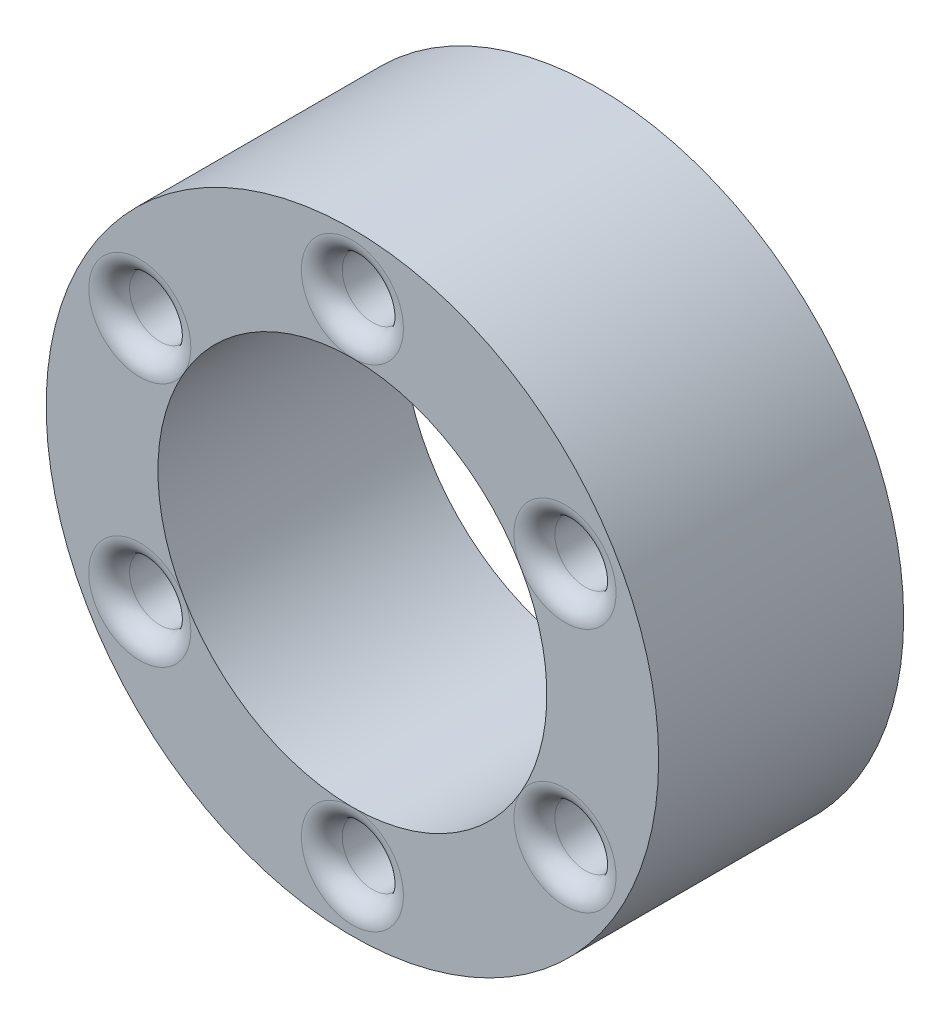
ISO-10303-21;
HEADER;
FILE_DESCRIPTION(('STEP AP214'),'2;1');
FILE_NAME('part.step','',(''),(''),'','','');
FILE_SCHEMA(('AUTOMOTIVE_DESIGN { 1 0 10303 214 1 1 1 1 }'));
ENDSEC;
DATA;
#1=APPLICATION_CONTEXT('core data for automotive mechanical design processes');
#2=APPLICATION_PROTOCOL_DEFINITION('international standard','automotive_design',2000,#1);
#3=PRODUCT_CONTEXT('',#1,'mechanical');
#4=PRODUCT('Part','Part','',(#3));
#5=PRODUCT_RELATED_PRODUCT_CATEGORY('part','',(#4));
#6=PRODUCT_DEFINITION_FORMATION('','',#4);
#7=PRODUCT_DEFINITION_CONTEXT('part definition',#1,'design');
#8=PRODUCT_DEFINITION('design','',#6,#7);
#9=PRODUCT_DEFINITION_SHAPE('','',#8);
#10=(LENGTH_UNIT() NAMED_UNIT(*) SI_UNIT(.MILLI.,.METRE.));
#11=(NAMED_UNIT(*) PLANE_ANGLE_UNIT() SI_UNIT($,.RADIAN.));
#12=(NAMED_UNIT(*) SI_UNIT($,.STERADIAN.) SOLID_ANGLE_UNIT());
#13=UNCERTAINTY_MEASURE_WITH_UNIT(LENGTH_MEASURE(1.E-05),#10,'distance_accuracy_value','');
#14=(GEOMETRIC_REPRESENTATION_CONTEXT(3) GLOBAL_UNCERTAINTY_ASSIGNED_CONTEXT((#13)) GLOBAL_UNIT_ASSIGNED_CONTEXT((#10,
#11,#12)) REPRESENTATION_CONTEXT('',''));
#15=CARTESIAN_POINT('',(0.,0.,0.));
#16=DIRECTION('',(0.,0.,1.));
#17=DIRECTION('',(1.,0.,0.));
#18=AXIS2_PLACEMENT_3D('',#15,#16,#17);
#19=CARTESIAN_POINT('',(0.,0.,3.));
#20=DIRECTION('',(0.,0.,1.));
#21=DIRECTION('',(1.,0.,0.));
#22=AXIS2_PLACEMENT_3D('',#19,#20,#21);
#23=PLANE('',#22);
#24=CARTESIAN_POINT('',(0.,0.,3.));
#25=DIRECTION('',(0.,0.,1.));
#26=DIRECTION('',(1.,0.,0.));
#27=AXIS2_PLACEMENT_3D('',#24,#25,#26);
#28=CIRCLE('',#27,3.75);
#29=CARTESIAN_POINT('',(3.75,0.,3.));
#30=VERTEX_POINT('',#29);
#31=EDGE_CURVE('E253',#30,#30,#28,.T.);
#32=ORIENTED_EDGE('',*,*,#31,.T.);
#33=EDGE_LOOP('',(#32));
#34=FACE_BOUND('',#33,.T.);
#35=CARTESIAN_POINT('',(0.,0.,3.));
#36=DIRECTION('',(0.,0.,1.));
#37=DIRECTION('',(1.,0.,0.));
#38=AXIS2_PLACEMENT_3D('',#35,#36,#37);
#39=CIRCLE('',#38,2.38125);
#40=CARTESIAN_POINT('',(-2.06222299276169,-1.190625,3.));
#41=VERTEX_POINT('',#40);
#42=CARTESIAN_POINT('',(0.,-2.38125,3.));
#43=VERTEX_POINT('',#42);
#44=EDGE_CURVE('E274',#41,#43,#39,.T.);
#45=ORIENTED_EDGE('',*,*,#44,.F.);
#46=CARTESIAN_POINT('',(-2.60348887012697,-1.503125,3.));
#47=DIRECTION('',(0.,0.,1.));
#48=DIRECTION('',(1.,0.,0.));
#49=AXIS2_PLACEMENT_3D('',#46,#47,#48);
#50=CIRCLE('',#49,0.625);
#51=EDGE_CURVE('E121',#41,#41,#50,.F.);
#52=ORIENTED_EDGE('',*,*,#51,.T.);
#53=CARTESIAN_POINT('',(-2.0622229927617,1.190625,3.));
#54=VERTEX_POINT('',#53);
#55=EDGE_CURVE('E270',#54,#41,#39,.T.);
#56=ORIENTED_EDGE('',*,*,#55,.F.);
#57=CARTESIAN_POINT('',(-2.60348887012697,1.503125,3.));
#58=DIRECTION('',(0.,0.,1.));
#59=DIRECTION('',(1.,0.,0.));
#60=AXIS2_PLACEMENT_3D('',#57,#58,#59);
#61=CIRCLE('',#60,0.625);
#62=EDGE_CURVE('E110',#54,#54,#61,.F.);
#63=ORIENTED_EDGE('',*,*,#62,.T.);
#64=CARTESIAN_POINT('',(0.,2.38125,3.));
#65=VERTEX_POINT('',#64);
#66=EDGE_CURVE('E266',#65,#54,#39,.T.);
#67=ORIENTED_EDGE('',*,*,#66,.F.);
#68=CARTESIAN_POINT('',(0.,3.00625,3.));
#69=DIRECTION('',(0.,0.,1.));
#70=DIRECTION('',(1.,0.,0.));
#71=AXIS2_PLACEMENT_3D('',#68,#69,#70);
#72=CIRCLE('',#71,0.625);
#73=EDGE_CURVE('E113',#65,#65,#72,.F.);
#74=ORIENTED_EDGE('',*,*,#73,.T.);
#75=CARTESIAN_POINT('',(2.06222299276169,1.190625,3.));
#76=VERTEX_POINT('',#75);
#77=EDGE_CURVE('E258',#76,#65,#39,.T.);
#78=ORIENTED_EDGE('',*,*,#77,.F.);
#79=CARTESIAN_POINT('',(2.60348887012697,1.503125,3.));
#80=DIRECTION('',(0.,0.,1.));
#81=DIRECTION('',(1.,0.,0.));
#82=AXIS2_PLACEMENT_3D('',#79,#80,#81);
#83=CIRCLE('',#82,0.625);
#84=EDGE_CURVE('E116',#76,#76,#83,.F.);
#85=ORIENTED_EDGE('',*,*,#84,.T.);
#86=CARTESIAN_POINT('',(2.0622229927617,-1.190625,3.));
#87=VERTEX_POINT('',#86);
#88=EDGE_CURVE('E262',#87,#76,#39,.T.);
#89=ORIENTED_EDGE('',*,*,#88,.F.);
#90=CARTESIAN_POINT('',(2.60348887012697,-1.503125,3.));
#91=DIRECTION('',(0.,0.,1.));
#92=DIRECTION('',(1.,0.,0.));
#93=AXIS2_PLACEMENT_3D('',#90,#91,#92);
#94=CIRCLE('',#93,0.625);
#95=EDGE_CURVE('E46',#87,#87,#94,.F.);
#96=ORIENTED_EDGE('',*,*,#95,.T.);
#97=EDGE_CURVE('E271',#43,#87,#39,.T.);
#98=ORIENTED_EDGE('',*,*,#97,.F.);
#99=CARTESIAN_POINT('',(0.,-3.00625,3.));
#100=DIRECTION('',(0.,0.,1.));
#101=DIRECTION('',(1.,0.,0.));
#102=AXIS2_PLACEMENT_3D('',#99,#100,#101);
#103=CIRCLE('',#102,0.625);
#104=EDGE_CURVE('E51',#43,#43,#103,.F.);
#105=ORIENTED_EDGE('',*,*,#104,.T.);
#106=EDGE_LOOP('',(#45,#52,#56,#63,#67,#74,#78,#85,#89,#96,#98,#105));
#107=FACE_BOUND('',#106,.T.);
#108=ADVANCED_FACE('F33',(#34,#107),#23,.T.);
#109=CARTESIAN_POINT('',(0.,0.,0.));
#110=DIRECTION('',(0.,0.,1.));
#111=DIRECTION('',(1.,0.,0.));
#112=AXIS2_PLACEMENT_3D('',#109,#110,#111);
#113=PLANE('',#112);
#114=CARTESIAN_POINT('',(0.,0.,0.));
#115=DIRECTION('',(0.,0.,1.));
#116=DIRECTION('',(1.,0.,0.));
#117=AXIS2_PLACEMENT_3D('',#114,#115,#116);
#118=CIRCLE('',#117,3.75);
#119=CARTESIAN_POINT('',(3.75,0.,0.));
#120=VERTEX_POINT('',#119);
#121=EDGE_CURVE('E254',#120,#120,#118,.T.);
#122=ORIENTED_EDGE('',*,*,#121,.F.);
#123=EDGE_LOOP('',(#122));
#124=FACE_BOUND('',#123,.T.);
#125=CARTESIAN_POINT('',(0.,0.,0.));
#126=DIRECTION('',(0.,0.,1.));
#127=DIRECTION('',(1.,0.,0.));
#128=AXIS2_PLACEMENT_3D('',#125,#126,#127);
#129=CIRCLE('',#128,2.38125);
#130=CARTESIAN_POINT('',(-2.0622229927617,1.190625,0.));
#131=VERTEX_POINT('',#130);
#132=CARTESIAN_POINT('',(-2.06222299276169,-1.190625,0.));
#133=VERTEX_POINT('',#132);
#134=EDGE_CURVE('E294',#131,#133,#129,.T.);
#135=ORIENTED_EDGE('',*,*,#134,.T.);
#136=CARTESIAN_POINT('',(-2.60348887012697,-1.503125,0.));
#137=DIRECTION('',(0.,0.,1.));
#138=DIRECTION('',(1.,0.,0.));
#139=AXIS2_PLACEMENT_3D('',#136,#137,#138);
#140=CIRCLE('',#139,0.625);
#141=EDGE_CURVE('E101',#133,#133,#140,.T.);
#142=ORIENTED_EDGE('',*,*,#141,.T.);
#143=CARTESIAN_POINT('',(0.,-2.38125,0.));
#144=VERTEX_POINT('',#143);
#145=EDGE_CURVE('E295',#133,#144,#129,.T.);
#146=ORIENTED_EDGE('',*,*,#145,.T.);
#147=CARTESIAN_POINT('',(0.,-3.00625,0.));
#148=DIRECTION('',(0.,0.,1.));
#149=DIRECTION('',(1.,0.,0.));
#150=AXIS2_PLACEMENT_3D('',#147,#148,#149);
#151=CIRCLE('',#150,0.625);
#152=EDGE_CURVE('E92',#144,#144,#151,.T.);
#153=ORIENTED_EDGE('',*,*,#152,.T.);
#154=CARTESIAN_POINT('',(2.0622229927617,-1.190625,0.));
#155=VERTEX_POINT('',#154);
#156=EDGE_CURVE('E297',#144,#155,#129,.T.);
#157=ORIENTED_EDGE('',*,*,#156,.T.);
#158=CARTESIAN_POINT('',(2.60348887012697,-1.503125,0.));
#159=DIRECTION('',(0.,0.,1.));
#160=DIRECTION('',(1.,0.,0.));
#161=AXIS2_PLACEMENT_3D('',#158,#159,#160);
#162=CIRCLE('',#161,0.625);
#163=EDGE_CURVE('E88',#155,#155,#162,.T.);
#164=ORIENTED_EDGE('',*,*,#163,.T.);
#165=CARTESIAN_POINT('',(2.06222299276169,1.190625,0.));
#166=VERTEX_POINT('',#165);
#167=EDGE_CURVE('E264',#155,#166,#129,.T.);
#168=ORIENTED_EDGE('',*,*,#167,.T.);
#169=CARTESIAN_POINT('',(2.60348887012697,1.503125,0.));
#170=DIRECTION('',(0.,0.,1.));
#171=DIRECTION('',(1.,0.,0.));
#172=AXIS2_PLACEMENT_3D('',#169,#170,#171);
#173=CIRCLE('',#172,0.625);
#174=EDGE_CURVE('E83',#166,#166,#173,.T.);
#175=ORIENTED_EDGE('',*,*,#174,.T.);
#176=CARTESIAN_POINT('',(0.,2.38125,0.));
#177=VERTEX_POINT('',#176);
#178=EDGE_CURVE('E260',#166,#177,#129,.T.);
#179=ORIENTED_EDGE('',*,*,#178,.T.);
#180=CARTESIAN_POINT('',(0.,3.00625,0.));
#181=DIRECTION('',(0.,0.,1.));
#182=DIRECTION('',(1.,0.,0.));
#183=AXIS2_PLACEMENT_3D('',#180,#181,#182);
#184=CIRCLE('',#183,0.625);
#185=EDGE_CURVE('E89',#177,#177,#184,.T.);
#186=ORIENTED_EDGE('',*,*,#185,.T.);
#187=EDGE_CURVE('E263',#177,#131,#129,.T.);
#188=ORIENTED_EDGE('',*,*,#187,.T.);
#189=CARTESIAN_POINT('',(-2.60348887012697,1.503125,0.));
#190=DIRECTION('',(0.,0.,1.));
#191=DIRECTION('',(1.,0.,0.));
#192=AXIS2_PLACEMENT_3D('',#189,#190,#191);
#193=CIRCLE('',#192,0.625);
#194=EDGE_CURVE('E95',#131,#131,#193,.T.);
#195=ORIENTED_EDGE('',*,*,#194,.T.);
#196=EDGE_LOOP('',(#135,#142,#146,#153,#157,#164,#168,#175,#179,#186,#188,#195));
#197=FACE_BOUND('',#196,.T.);
#198=ADVANCED_FACE('F161',(#124,#197),#113,.F.);
#199=CARTESIAN_POINT('',(0.,0.,3.));
#200=DIRECTION('',(0.,0.,-1.));
#201=DIRECTION('',(-1.,0.,0.));
#202=AXIS2_PLACEMENT_3D('',#199,#200,#201);
#203=CYLINDRICAL_SURFACE('',#202,3.75);
#204=ORIENTED_EDGE('',*,*,#31,.F.);
#205=EDGE_LOOP('',(#204));
#206=FACE_BOUND('',#205,.T.);
#207=ORIENTED_EDGE('',*,*,#121,.T.);
#208=EDGE_LOOP('',(#207));
#209=FACE_BOUND('',#208,.T.);
#210=ADVANCED_FACE('F167',(#206,#209),#203,.T.);
#211=CARTESIAN_POINT('',(0.,0.,3.));
#212=DIRECTION('',(0.,0.,-1.));
#213=DIRECTION('',(-1.,0.,0.));
#214=AXIS2_PLACEMENT_3D('',#211,#212,#213);
#215=CYLINDRICAL_SURFACE('',#214,2.38125);
#216=ORIENTED_EDGE('',*,*,#77,.T.);
#217=ORIENTED_EDGE('',*,*,#66,.T.);
#218=ORIENTED_EDGE('',*,*,#55,.T.);
#219=ORIENTED_EDGE('',*,*,#44,.T.);
#220=ORIENTED_EDGE('',*,*,#97,.T.);
#221=ORIENTED_EDGE('',*,*,#88,.T.);
#222=EDGE_LOOP('',(#216,#217,#218,#219,#220,#221));
#223=FACE_BOUND('',#222,.T.);
#224=ORIENTED_EDGE('',*,*,#178,.F.);
#225=ORIENTED_EDGE('',*,*,#167,.F.);
#226=ORIENTED_EDGE('',*,*,#156,.F.);
#227=ORIENTED_EDGE('',*,*,#145,.F.);
#228=ORIENTED_EDGE('',*,*,#134,.F.);
#229=ORIENTED_EDGE('',*,*,#187,.F.);
#230=EDGE_LOOP('',(#224,#225,#226,#227,#228,#229));
#231=FACE_BOUND('',#230,.T.);
#232=ADVANCED_FACE('F173',(#223,#231),#215,.F.);
#233=CARTESIAN_POINT('',(0.,3.00625,3.));
#234=DIRECTION('',(0.,0.,-1.));
#235=DIRECTION('',(-1.,0.,0.));
#236=AXIS2_PLACEMENT_3D('',#233,#234,#235);
#237=CYLINDRICAL_SURFACE('',#236,0.375);
#238=CARTESIAN_POINT('',(0.,3.00625,0.25));
#239=DIRECTION('',(0.,0.,1.));
#240=DIRECTION('',(1.,0.,0.));
#241=AXIS2_PLACEMENT_3D('',#238,#239,#240);
#242=CIRCLE('',#241,0.375);
#243=CARTESIAN_POINT('',(0.375,3.00625,0.25));
#244=VERTEX_POINT('',#243);
#245=EDGE_CURVE('E145',#244,#244,#242,.F.);
#246=ORIENTED_EDGE('',*,*,#245,.T.);
#247=EDGE_LOOP('',(#246));
#248=FACE_BOUND('',#247,.T.);
#249=CARTESIAN_POINT('',(0.,3.00625,2.75));
#250=DIRECTION('',(0.,0.,1.));
#251=DIRECTION('',(1.,0.,0.));
#252=AXIS2_PLACEMENT_3D('',#249,#250,#251);
#253=CIRCLE('',#252,0.375);
#254=CARTESIAN_POINT('',(0.375,3.00625,2.75));
#255=VERTEX_POINT('',#254);
#256=EDGE_CURVE('E142',#255,#255,#253,.T.);
#257=ORIENTED_EDGE('',*,*,#256,.T.);
#258=EDGE_LOOP('',(#257));
#259=FACE_BOUND('',#258,.T.);
#260=ADVANCED_FACE('F219',(#248,#259),#237,.F.);
#261=CARTESIAN_POINT('',(0.,-3.00625,3.));
#262=DIRECTION('',(0.,0.,-1.));
#263=DIRECTION('',(-1.,0.,0.));
#264=AXIS2_PLACEMENT_3D('',#261,#262,#263);
#265=CYLINDRICAL_SURFACE('',#264,0.375);
#266=CARTESIAN_POINT('',(0.,-3.00625,0.25));
#267=DIRECTION('',(0.,0.,1.));
#268=DIRECTION('',(1.,0.,0.));
#269=AXIS2_PLACEMENT_3D('',#266,#267,#268);
#270=CIRCLE('',#269,0.375);
#271=CARTESIAN_POINT('',(0.375,-3.00625,0.25));
#272=VERTEX_POINT('',#271);
#273=EDGE_CURVE('E127',#272,#272,#270,.F.);
#274=ORIENTED_EDGE('',*,*,#273,.T.);
#275=EDGE_LOOP('',(#274));
#276=FACE_BOUND('',#275,.T.);
#277=CARTESIAN_POINT('',(0.,-3.00625,2.75));
#278=DIRECTION('',(0.,0.,1.));
#279=DIRECTION('',(1.,0.,0.));
#280=AXIS2_PLACEMENT_3D('',#277,#278,#279);
#281=CIRCLE('',#280,0.375);
#282=CARTESIAN_POINT('',(0.375,-3.00625,2.75));
#283=VERTEX_POINT('',#282);
#284=EDGE_CURVE('E124',#283,#283,#281,.T.);
#285=ORIENTED_EDGE('',*,*,#284,.T.);
#286=EDGE_LOOP('',(#285));
#287=FACE_BOUND('',#286,.T.);
#288=ADVANCED_FACE('F221',(#276,#287),#265,.F.);
#289=CARTESIAN_POINT('',(2.60348887012697,1.503125,3.));
#290=DIRECTION('',(0.,0.,-1.));
#291=DIRECTION('',(-1.,0.,0.));
#292=AXIS2_PLACEMENT_3D('',#289,#290,#291);
#293=CYLINDRICAL_SURFACE('',#292,0.375);
#294=CARTESIAN_POINT('',(2.60348887012697,1.503125,0.25));
#295=DIRECTION('',(0.,0.,1.));
#296=DIRECTION('',(1.,0.,0.));
#297=AXIS2_PLACEMENT_3D('',#294,#295,#296);
#298=CIRCLE('',#297,0.375);
#299=CARTESIAN_POINT('',(2.97848887012697,1.503125,0.25));
#300=VERTEX_POINT('',#299);
#301=EDGE_CURVE('E139',#300,#300,#298,.F.);
#302=ORIENTED_EDGE('',*,*,#301,.T.);
#303=EDGE_LOOP('',(#302));
#304=FACE_BOUND('',#303,.T.);
#305=CARTESIAN_POINT('',(2.60348887012697,1.503125,2.75));
#306=DIRECTION('',(0.,0.,1.));
#307=DIRECTION('',(1.,0.,0.));
#308=AXIS2_PLACEMENT_3D('',#305,#306,#307);
#309=CIRCLE('',#308,0.375);
#310=CARTESIAN_POINT('',(2.97848887012697,1.503125,2.75));
#311=VERTEX_POINT('',#310);
#312=EDGE_CURVE('E136',#311,#311,#309,.T.);
#313=ORIENTED_EDGE('',*,*,#312,.T.);
#314=EDGE_LOOP('',(#313));
#315=FACE_BOUND('',#314,.T.);
#316=ADVANCED_FACE('F227',(#304,#315),#293,.F.);
#317=CARTESIAN_POINT('',(2.60348887012697,-1.503125,3.));
#318=DIRECTION('',(0.,0.,-1.));
#319=DIRECTION('',(-1.,0.,0.));
#320=AXIS2_PLACEMENT_3D('',#317,#318,#319);
#321=CYLINDRICAL_SURFACE('',#320,0.375);
#322=CARTESIAN_POINT('',(2.60348887012697,-1.503125,0.25));
#323=DIRECTION('',(0.,0.,1.));
#324=DIRECTION('',(1.,0.,0.));
#325=AXIS2_PLACEMENT_3D('',#322,#323,#324);
#326=CIRCLE('',#325,0.375);
#327=CARTESIAN_POINT('',(2.97848887012697,-1.503125,0.25));
#328=VERTEX_POINT('',#327);
#329=EDGE_CURVE('E133',#328,#328,#326,.F.);
#330=ORIENTED_EDGE('',*,*,#329,.T.);
#331=EDGE_LOOP('',(#330));
#332=FACE_BOUND('',#331,.T.);
#333=CARTESIAN_POINT('',(2.60348887012697,-1.503125,2.75));
#334=DIRECTION('',(0.,0.,1.));
#335=DIRECTION('',(1.,0.,0.));
#336=AXIS2_PLACEMENT_3D('',#333,#334,#335);
#337=CIRCLE('',#336,0.375);
#338=CARTESIAN_POINT('',(2.97848887012697,-1.503125,2.75));
#339=VERTEX_POINT('',#338);
#340=EDGE_CURVE('E130',#339,#339,#337,.T.);
#341=ORIENTED_EDGE('',*,*,#340,.T.);
#342=EDGE_LOOP('',(#341));
#343=FACE_BOUND('',#342,.T.);
#344=ADVANCED_FACE('F234',(#332,#343),#321,.F.);
#345=CARTESIAN_POINT('',(-2.60348887012697,-1.503125,3.));
#346=DIRECTION('',(0.,0.,-1.));
#347=DIRECTION('',(-1.,0.,0.));
#348=AXIS2_PLACEMENT_3D('',#345,#346,#347);
#349=CYLINDRICAL_SURFACE('',#348,0.375);
#350=CARTESIAN_POINT('',(-2.60348887012697,-1.503125,0.25));
#351=DIRECTION('',(0.,0.,1.));
#352=DIRECTION('',(1.,0.,0.));
#353=AXIS2_PLACEMENT_3D('',#350,#351,#352);
#354=CIRCLE('',#353,0.375);
#355=CARTESIAN_POINT('',(-2.22848887012697,-1.503125,0.25));
#356=VERTEX_POINT('',#355);
#357=EDGE_CURVE('E107',#356,#356,#354,.F.);
#358=ORIENTED_EDGE('',*,*,#357,.T.);
#359=EDGE_LOOP('',(#358));
#360=FACE_BOUND('',#359,.T.);
#361=CARTESIAN_POINT('',(-2.60348887012697,-1.503125,2.75));
#362=DIRECTION('',(0.,0.,1.));
#363=DIRECTION('',(1.,0.,0.));
#364=AXIS2_PLACEMENT_3D('',#361,#362,#363);
#365=CIRCLE('',#364,0.375);
#366=CARTESIAN_POINT('',(-2.22848887012697,-1.503125,2.75));
#367=VERTEX_POINT('',#366);
#368=EDGE_CURVE('E104',#367,#367,#365,.T.);
#369=ORIENTED_EDGE('',*,*,#368,.T.);
#370=EDGE_LOOP('',(#369));
#371=FACE_BOUND('',#370,.T.);
#372=ADVANCED_FACE('F238',(#360,#371),#349,.F.);
#373=CARTESIAN_POINT('',(-2.60348887012697,1.503125,3.));
#374=DIRECTION('',(0.,0.,-1.));
#375=DIRECTION('',(-1.,0.,0.));
#376=AXIS2_PLACEMENT_3D('',#373,#374,#375);
#377=CYLINDRICAL_SURFACE('',#376,0.375);
#378=CARTESIAN_POINT('',(-2.60348887012697,1.503125,0.25));
#379=DIRECTION('',(0.,0.,1.));
#380=DIRECTION('',(1.,0.,0.));
#381=AXIS2_PLACEMENT_3D('',#378,#379,#380);
#382=CIRCLE('',#381,0.375);
#383=CARTESIAN_POINT('',(-2.22848887012697,1.503125,0.25));
#384=VERTEX_POINT('',#383);
#385=EDGE_CURVE('E11',#384,#384,#382,.F.);
#386=ORIENTED_EDGE('',*,*,#385,.T.);
#387=EDGE_LOOP('',(#386));
#388=FACE_BOUND('',#387,.T.);
#389=CARTESIAN_POINT('',(-2.60348887012697,1.503125,2.75));
#390=DIRECTION('',(0.,0.,1.));
#391=DIRECTION('',(1.,0.,0.));
#392=AXIS2_PLACEMENT_3D('',#389,#390,#391);
#393=CIRCLE('',#392,0.375);
#394=CARTESIAN_POINT('',(-2.22848887012697,1.503125,2.75));
#395=VERTEX_POINT('',#394);
#396=EDGE_CURVE('E41',#395,#395,#393,.T.);
#397=ORIENTED_EDGE('',*,*,#396,.T.);
#398=EDGE_LOOP('',(#397));
#399=FACE_BOUND('',#398,.T.);
#400=ADVANCED_FACE('F150',(#388,#399),#377,.F.);
#401=CARTESIAN_POINT('',(-2.60348887012697,-1.503125,0.25));
#402=DIRECTION('',(0.,0.,1.));
#403=DIRECTION('',(1.,0.,0.));
#404=AXIS2_PLACEMENT_3D('',#401,#402,#403);
#405=TOROIDAL_SURFACE('',#404,0.625,0.25);
#406=ORIENTED_EDGE('',*,*,#357,.F.);
#407=EDGE_LOOP('',(#406));
#408=FACE_BOUND('',#407,.T.);
#409=ORIENTED_EDGE('',*,*,#141,.F.);
#410=EDGE_LOOP('',(#409));
#411=FACE_BOUND('',#410,.T.);
#412=ADVANCED_FACE('F179',(#408,#411),#405,.T.);
#413=CARTESIAN_POINT('',(-2.60348887012697,-1.503125,2.75));
#414=DIRECTION('',(0.,0.,1.));
#415=DIRECTION('',(1.,0.,0.));
#416=AXIS2_PLACEMENT_3D('',#413,#414,#415);
#417=TOROIDAL_SURFACE('',#416,0.625,0.25);
#418=ORIENTED_EDGE('',*,*,#51,.F.);
#419=EDGE_LOOP('',(#418));
#420=FACE_BOUND('',#419,.T.);
#421=ORIENTED_EDGE('',*,*,#368,.F.);
#422=EDGE_LOOP('',(#421));
#423=FACE_BOUND('',#422,.T.);
#424=ADVANCED_FACE('F182',(#420,#423),#417,.T.);
#425=CARTESIAN_POINT('',(0.,-3.00625,0.25));
#426=DIRECTION('',(0.,0.,1.));
#427=DIRECTION('',(1.,0.,0.));
#428=AXIS2_PLACEMENT_3D('',#425,#426,#427);
#429=TOROIDAL_SURFACE('',#428,0.625,0.25);
#430=ORIENTED_EDGE('',*,*,#273,.F.);
#431=EDGE_LOOP('',(#430));
#432=FACE_BOUND('',#431,.T.);
#433=ORIENTED_EDGE('',*,*,#152,.F.);
#434=EDGE_LOOP('',(#433));
#435=FACE_BOUND('',#434,.T.);
#436=ADVANCED_FACE('F186',(#432,#435),#429,.T.);
#437=CARTESIAN_POINT('',(0.,-3.00625,2.75));
#438=DIRECTION('',(0.,0.,1.));
#439=DIRECTION('',(1.,0.,0.));
#440=AXIS2_PLACEMENT_3D('',#437,#438,#439);
#441=TOROIDAL_SURFACE('',#440,0.625,0.25);
#442=ORIENTED_EDGE('',*,*,#104,.F.);
#443=EDGE_LOOP('',(#442));
#444=FACE_BOUND('',#443,.T.);
#445=ORIENTED_EDGE('',*,*,#284,.F.);
#446=EDGE_LOOP('',(#445));
#447=FACE_BOUND('',#446,.T.);
#448=ADVANCED_FACE('F190',(#444,#447),#441,.T.);
#449=CARTESIAN_POINT('',(2.60348887012697,-1.503125,0.25));
#450=DIRECTION('',(0.,0.,1.));
#451=DIRECTION('',(1.,0.,0.));
#452=AXIS2_PLACEMENT_3D('',#449,#450,#451);
#453=TOROIDAL_SURFACE('',#452,0.625,0.25);
#454=ORIENTED_EDGE('',*,*,#329,.F.);
#455=EDGE_LOOP('',(#454));
#456=FACE_BOUND('',#455,.T.);
#457=ORIENTED_EDGE('',*,*,#163,.F.);
#458=EDGE_LOOP('',(#457));
#459=FACE_BOUND('',#458,.T.);
#460=ADVANCED_FACE('F194',(#456,#459),#453,.T.);
#461=CARTESIAN_POINT('',(2.60348887012697,-1.503125,2.75));
#462=DIRECTION('',(0.,0.,1.));
#463=DIRECTION('',(1.,0.,0.));
#464=AXIS2_PLACEMENT_3D('',#461,#462,#463);
#465=TOROIDAL_SURFACE('',#464,0.625,0.25);
#466=ORIENTED_EDGE('',*,*,#95,.F.);
#467=EDGE_LOOP('',(#466));
#468=FACE_BOUND('',#467,.T.);
#469=ORIENTED_EDGE('',*,*,#340,.F.);
#470=EDGE_LOOP('',(#469));
#471=FACE_BOUND('',#470,.T.);
#472=ADVANCED_FACE('F197',(#468,#471),#465,.T.);
#473=CARTESIAN_POINT('',(2.60348887012697,1.503125,0.25));
#474=DIRECTION('',(0.,0.,1.));
#475=DIRECTION('',(1.,0.,0.));
#476=AXIS2_PLACEMENT_3D('',#473,#474,#475);
#477=TOROIDAL_SURFACE('',#476,0.625,0.25);
#478=ORIENTED_EDGE('',*,*,#301,.F.);
#479=EDGE_LOOP('',(#478));
#480=FACE_BOUND('',#479,.T.);
#481=ORIENTED_EDGE('',*,*,#174,.F.);
#482=EDGE_LOOP('',(#481));
#483=FACE_BOUND('',#482,.T.);
#484=ADVANCED_FACE('F84',(#480,#483),#477,.T.);
#485=CARTESIAN_POINT('',(2.60348887012697,1.503125,2.75));
#486=DIRECTION('',(0.,0.,1.));
#487=DIRECTION('',(1.,0.,0.));
#488=AXIS2_PLACEMENT_3D('',#485,#486,#487);
#489=TOROIDAL_SURFACE('',#488,0.625,0.25);
#490=ORIENTED_EDGE('',*,*,#84,.F.);
#491=EDGE_LOOP('',(#490));
#492=FACE_BOUND('',#491,.T.);
#493=ORIENTED_EDGE('',*,*,#312,.F.);
#494=EDGE_LOOP('',(#493));
#495=FACE_BOUND('',#494,.T.);
#496=ADVANCED_FACE('F203',(#492,#495),#489,.T.);
#497=CARTESIAN_POINT('',(0.,3.00625,0.25));
#498=DIRECTION('',(0.,0.,1.));
#499=DIRECTION('',(1.,0.,0.));
#500=AXIS2_PLACEMENT_3D('',#497,#498,#499);
#501=TOROIDAL_SURFACE('',#500,0.625,0.25);
#502=ORIENTED_EDGE('',*,*,#245,.F.);
#503=EDGE_LOOP('',(#502));
#504=FACE_BOUND('',#503,.T.);
#505=ORIENTED_EDGE('',*,*,#185,.F.);
#506=EDGE_LOOP('',(#505));
#507=FACE_BOUND('',#506,.T.);
#508=ADVANCED_FACE('F207',(#504,#507),#501,.T.);
#509=CARTESIAN_POINT('',(0.,3.00625,2.75));
#510=DIRECTION('',(0.,0.,1.));
#511=DIRECTION('',(1.,0.,0.));
#512=AXIS2_PLACEMENT_3D('',#509,#510,#511);
#513=TOROIDAL_SURFACE('',#512,0.625,0.25);
#514=ORIENTED_EDGE('',*,*,#73,.F.);
#515=EDGE_LOOP('',(#514));
#516=FACE_BOUND('',#515,.T.);
#517=ORIENTED_EDGE('',*,*,#256,.F.);
#518=EDGE_LOOP('',(#517));
#519=FACE_BOUND('',#518,.T.);
#520=ADVANCED_FACE('F158',(#516,#519),#513,.T.);
#521=CARTESIAN_POINT('',(-2.60348887012697,1.503125,0.25));
#522=DIRECTION('',(0.,0.,1.));
#523=DIRECTION('',(1.,0.,0.));
#524=AXIS2_PLACEMENT_3D('',#521,#522,#523);
#525=TOROIDAL_SURFACE('',#524,0.625,0.25);
#526=ORIENTED_EDGE('',*,*,#385,.F.);
#527=EDGE_LOOP('',(#526));
#528=FACE_BOUND('',#527,.T.);
#529=ORIENTED_EDGE('',*,*,#194,.F.);
#530=EDGE_LOOP('',(#529));
#531=FACE_BOUND('',#530,.T.);
#532=ADVANCED_FACE('F153',(#528,#531),#525,.T.);
#533=CARTESIAN_POINT('',(-2.60348887012697,1.503125,2.75));
#534=DIRECTION('',(0.,0.,1.));
#535=DIRECTION('',(1.,0.,0.));
#536=AXIS2_PLACEMENT_3D('',#533,#534,#535);
#537=TOROIDAL_SURFACE('',#536,0.625,0.25);
#538=ORIENTED_EDGE('',*,*,#62,.F.);
#539=EDGE_LOOP('',(#538));
#540=FACE_BOUND('',#539,.T.);
#541=ORIENTED_EDGE('',*,*,#396,.F.);
#542=EDGE_LOOP('',(#541));
#543=FACE_BOUND('',#542,.T.);
#544=ADVANCED_FACE('F35',(#540,#543),#537,.T.);
#545=CLOSED_SHELL('',(#108,#198,#210,#232,#260,#288,#316,#344,#372,#400,#412,#424,#436,#448,
#460,#472,#484,#496,#508,#520,#532,#544));
#546=MANIFOLD_SOLID_BREP('B2',#545);
#547=ADVANCED_BREP_SHAPE_REPRESENTATION('',(#18,#546),#14);
#548=SHAPE_DEFINITION_REPRESENTATION(#9,#547);
ENDSEC;
END-ISO-10303-21;
